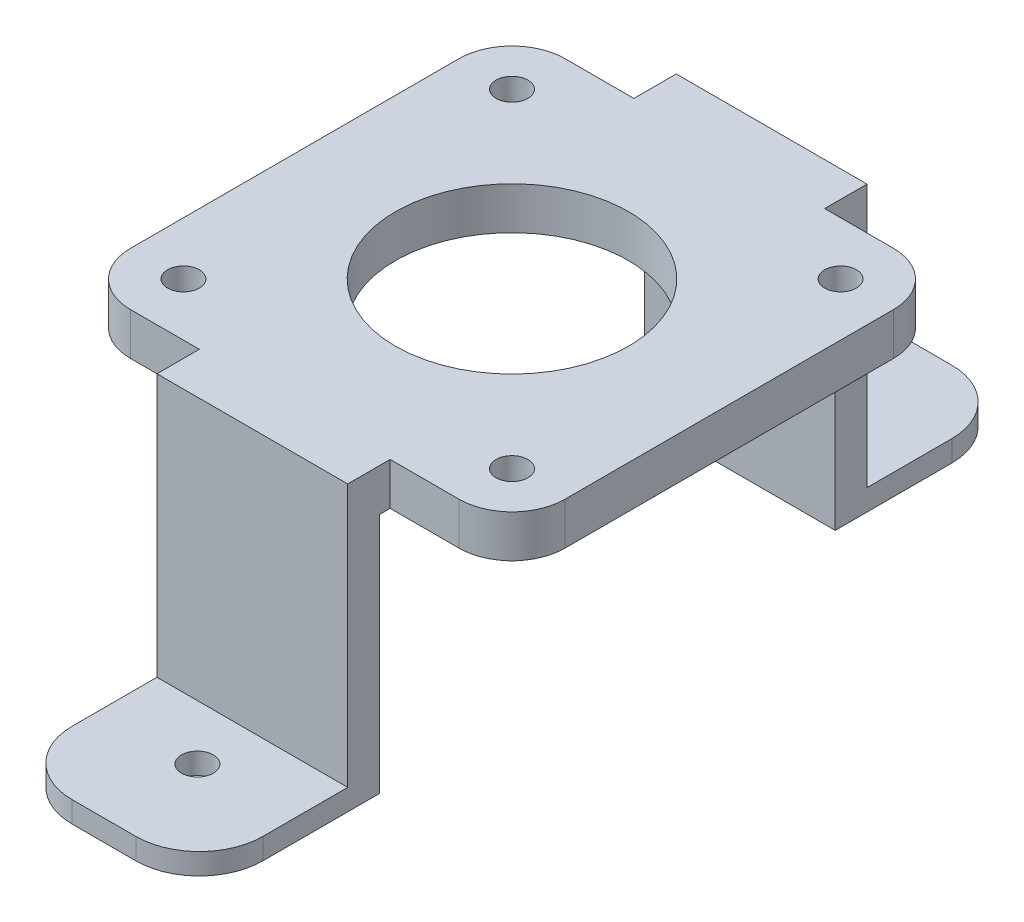
ISO-10303-21;
HEADER;
FILE_DESCRIPTION(('STEP AP214'),'2;1');
FILE_NAME('part.step','',(''),(''),'','','');
FILE_SCHEMA(('AUTOMOTIVE_DESIGN { 1 0 10303 214 1 1 1 1 }'));
ENDSEC;
DATA;
#1=APPLICATION_CONTEXT('core data for automotive mechanical design processes');
#2=APPLICATION_PROTOCOL_DEFINITION('international standard','automotive_design',2000,#1);
#3=PRODUCT_CONTEXT('',#1,'mechanical');
#4=PRODUCT('Part','Part','',(#3));
#5=PRODUCT_RELATED_PRODUCT_CATEGORY('part','',(#4));
#6=PRODUCT_DEFINITION_FORMATION('','',#4);
#7=PRODUCT_DEFINITION_CONTEXT('part definition',#1,'design');
#8=PRODUCT_DEFINITION('design','',#6,#7);
#9=PRODUCT_DEFINITION_SHAPE('','',#8);
#10=(LENGTH_UNIT() NAMED_UNIT(*) SI_UNIT(.MILLI.,.METRE.));
#11=(NAMED_UNIT(*) PLANE_ANGLE_UNIT() SI_UNIT($,.RADIAN.));
#12=(NAMED_UNIT(*) SI_UNIT($,.STERADIAN.) SOLID_ANGLE_UNIT());
#13=UNCERTAINTY_MEASURE_WITH_UNIT(LENGTH_MEASURE(1.E-05),#10,'distance_accuracy_value','');
#14=(GEOMETRIC_REPRESENTATION_CONTEXT(3) GLOBAL_UNCERTAINTY_ASSIGNED_CONTEXT((#13)) GLOBAL_UNIT_ASSIGNED_CONTEXT((#10,
#11,#12)) REPRESENTATION_CONTEXT('',''));
#15=CARTESIAN_POINT('',(0.,0.,0.));
#16=DIRECTION('',(0.,0.,1.));
#17=DIRECTION('',(1.,0.,0.));
#18=AXIS2_PLACEMENT_3D('',#15,#16,#17);
#19=CARTESIAN_POINT('',(-9.00000000000001,4.,-24.5));
#20=DIRECTION('',(-1.,0.,0.));
#21=DIRECTION('',(0.,-1.,0.));
#22=AXIS2_PLACEMENT_3D('',#19,#20,#21);
#23=PLANE('',#22);
#24=DIRECTION('',(0.,1.,0.));
#25=VECTOR('',#24,1.);
#26=CARTESIAN_POINT('',(-9.,-22.8,-21.5));
#27=LINE('',#26,#25);
#28=CARTESIAN_POINT('',(-9.,-22.8,-21.5));
#29=VERTEX_POINT('',#28);
#30=CARTESIAN_POINT('',(-9.,0.,-21.5));
#31=VERTEX_POINT('',#30);
#32=EDGE_CURVE('E61',#29,#31,#27,.T.);
#33=ORIENTED_EDGE('',*,*,#32,.T.);
#34=DIRECTION('',(0.,0.,1.));
#35=VECTOR('',#34,1.);
#36=CARTESIAN_POINT('',(-9.,0.,-21.5));
#37=LINE('',#36,#35);
#38=CARTESIAN_POINT('',(-9.,0.,-20.5));
#39=VERTEX_POINT('',#38);
#40=EDGE_CURVE('E532',#31,#39,#37,.T.);
#41=ORIENTED_EDGE('',*,*,#40,.T.);
#42=DIRECTION('',(0.,-1.,0.));
#43=VECTOR('',#42,1.);
#44=CARTESIAN_POINT('',(-9.00000000000001,4.,-20.5));
#45=LINE('',#44,#43);
#46=CARTESIAN_POINT('',(-9.00000000000001,4.,-20.5));
#47=VERTEX_POINT('',#46);
#48=EDGE_CURVE('E922',#47,#39,#45,.T.);
#49=ORIENTED_EDGE('',*,*,#48,.F.);
#50=DIRECTION('',(0.,0.,1.));
#51=VECTOR('',#50,1.);
#52=CARTESIAN_POINT('',(-9.00000000000001,4.,-24.5));
#53=LINE('',#52,#51);
#54=CARTESIAN_POINT('',(-9.00000000000001,4.,-24.5));
#55=VERTEX_POINT('',#54);
#56=EDGE_CURVE('E261',#55,#47,#53,.T.);
#57=ORIENTED_EDGE('',*,*,#56,.F.);
#58=DIRECTION('',(0.,-1.,0.));
#59=VECTOR('',#58,1.);
#60=CARTESIAN_POINT('',(-9.00000000000001,4.,-24.5));
#61=LINE('',#60,#59);
#62=CARTESIAN_POINT('',(-9.,-20.8,-24.5));
#63=VERTEX_POINT('',#62);
#64=EDGE_CURVE('E934',#55,#63,#61,.T.);
#65=ORIENTED_EDGE('',*,*,#64,.T.);
#66=DIRECTION('',(0.,0.,1.));
#67=VECTOR('',#66,1.);
#68=CARTESIAN_POINT('',(-9.,-20.8,-24.5));
#69=LINE('',#68,#67);
#70=CARTESIAN_POINT('',(-9.,-20.8,-32.5));
#71=VERTEX_POINT('',#70);
#72=EDGE_CURVE('E901',#71,#63,#69,.T.);
#73=ORIENTED_EDGE('',*,*,#72,.F.);
#74=DIRECTION('',(0.,-1.,0.));
#75=VECTOR('',#74,1.);
#76=CARTESIAN_POINT('',(-9.,-20.8,-32.5));
#77=LINE('',#76,#75);
#78=CARTESIAN_POINT('',(-9.,-22.8,-32.5));
#79=VERTEX_POINT('',#78);
#80=EDGE_CURVE('E913',#71,#79,#77,.T.);
#81=ORIENTED_EDGE('',*,*,#80,.T.);
#82=DIRECTION('',(0.,0.,1.));
#83=VECTOR('',#82,1.);
#84=CARTESIAN_POINT('',(-9.,-22.8,-24.5));
#85=LINE('',#84,#83);
#86=EDGE_CURVE('E256',#79,#29,#85,.T.);
#87=ORIENTED_EDGE('',*,*,#86,.T.);
#88=EDGE_LOOP('',(#33,#41,#49,#57,#65,#73,#81,#87));
#89=FACE_BOUND('',#88,.T.);
#90=ADVANCED_FACE('F45',(#89),#23,.T.);
#91=CARTESIAN_POINT('',(8.99999999999999,4.,-24.5));
#92=DIRECTION('',(-1.,0.,0.));
#93=DIRECTION('',(0.,-1.,0.));
#94=AXIS2_PLACEMENT_3D('',#91,#92,#93);
#95=PLANE('',#94);
#96=DIRECTION('',(0.,0.,1.));
#97=VECTOR('',#96,1.);
#98=CARTESIAN_POINT('',(8.99999999999999,0.,-21.5));
#99=LINE('',#98,#97);
#100=CARTESIAN_POINT('',(8.99999999999999,0.,-21.5));
#101=VERTEX_POINT('',#100);
#102=CARTESIAN_POINT('',(8.99999999999999,0.,-20.5));
#103=VERTEX_POINT('',#102);
#104=EDGE_CURVE('E246',#101,#103,#99,.T.);
#105=ORIENTED_EDGE('',*,*,#104,.F.);
#106=DIRECTION('',(0.,-1.,0.));
#107=VECTOR('',#106,1.);
#108=CARTESIAN_POINT('',(8.99999999999999,-22.8,-21.5));
#109=LINE('',#108,#107);
#110=CARTESIAN_POINT('',(8.99999999999999,-22.8,-21.5));
#111=VERTEX_POINT('',#110);
#112=EDGE_CURVE('E233',#101,#111,#109,.T.);
#113=ORIENTED_EDGE('',*,*,#112,.T.);
#114=DIRECTION('',(0.,0.,1.));
#115=VECTOR('',#114,1.);
#116=CARTESIAN_POINT('',(9.,-22.8,-24.5));
#117=LINE('',#116,#115);
#118=CARTESIAN_POINT('',(9.,-22.8,-32.5));
#119=VERTEX_POINT('',#118);
#120=EDGE_CURVE('E243',#119,#111,#117,.T.);
#121=ORIENTED_EDGE('',*,*,#120,.F.);
#122=DIRECTION('',(0.,-1.,0.));
#123=VECTOR('',#122,1.);
#124=CARTESIAN_POINT('',(9.,-20.8,-32.5));
#125=LINE('',#124,#123);
#126=CARTESIAN_POINT('',(9.,-20.8,-32.5));
#127=VERTEX_POINT('',#126);
#128=EDGE_CURVE('E919',#127,#119,#125,.T.);
#129=ORIENTED_EDGE('',*,*,#128,.F.);
#130=DIRECTION('',(0.,0.,-1.));
#131=VECTOR('',#130,1.);
#132=CARTESIAN_POINT('',(9.,-20.8,-24.5));
#133=LINE('',#132,#131);
#134=CARTESIAN_POINT('',(9.,-20.8,-24.5));
#135=VERTEX_POINT('',#134);
#136=EDGE_CURVE('E895',#135,#127,#133,.T.);
#137=ORIENTED_EDGE('',*,*,#136,.F.);
#138=DIRECTION('',(0.,-1.,0.));
#139=VECTOR('',#138,1.);
#140=CARTESIAN_POINT('',(8.99999999999999,4.,-24.5));
#141=LINE('',#140,#139);
#142=CARTESIAN_POINT('',(8.99999999999999,4.,-24.5));
#143=VERTEX_POINT('',#142);
#144=EDGE_CURVE('E263',#143,#135,#141,.T.);
#145=ORIENTED_EDGE('',*,*,#144,.F.);
#146=DIRECTION('',(0.,0.,1.));
#147=VECTOR('',#146,1.);
#148=CARTESIAN_POINT('',(8.99999999999999,4.,-24.5));
#149=LINE('',#148,#147);
#150=CARTESIAN_POINT('',(8.99999999999999,4.,-20.5));
#151=VERTEX_POINT('',#150);
#152=EDGE_CURVE('E255',#143,#151,#149,.T.);
#153=ORIENTED_EDGE('',*,*,#152,.T.);
#154=DIRECTION('',(0.,-1.,0.));
#155=VECTOR('',#154,1.);
#156=CARTESIAN_POINT('',(8.99999999999999,4.,-20.5));
#157=LINE('',#156,#155);
#158=EDGE_CURVE('E938',#151,#103,#157,.T.);
#159=ORIENTED_EDGE('',*,*,#158,.T.);
#160=EDGE_LOOP('',(#105,#113,#121,#129,#137,#145,#153,#159));
#161=FACE_BOUND('',#160,.T.);
#162=ADVANCED_FACE('F241',(#161),#95,.F.);
#163=CARTESIAN_POINT('',(-9.,-22.8,-24.5));
#164=DIRECTION('',(0.,-1.,0.));
#165=DIRECTION('',(0.,0.,-1.));
#166=AXIS2_PLACEMENT_3D('',#163,#164,#165);
#167=PLANE('',#166);
#168=CARTESIAN_POINT('',(0.,-22.8,-29.6787295351869));
#169=DIRECTION('',(0.,-1.,0.));
#170=DIRECTION('',(0.,0.,-1.));
#171=AXIS2_PLACEMENT_3D('',#168,#169,#170);
#172=CIRCLE('',#171,1.5);
#173=CARTESIAN_POINT('',(0.,-22.8,-31.1787295351869));
#174=VERTEX_POINT('',#173);
#175=EDGE_CURVE('E880',#174,#174,#172,.T.);
#176=ORIENTED_EDGE('',*,*,#175,.F.);
#177=EDGE_LOOP('',(#176));
#178=FACE_BOUND('',#177,.T.);
#179=ORIENTED_EDGE('',*,*,#120,.T.);
#180=DIRECTION('',(-1.,0.,0.));
#181=VECTOR('',#180,1.);
#182=CARTESIAN_POINT('',(-9.,-22.8,-21.5));
#183=LINE('',#182,#181);
#184=EDGE_CURVE('E230',#111,#29,#183,.T.);
#185=ORIENTED_EDGE('',*,*,#184,.T.);
#186=ORIENTED_EDGE('',*,*,#86,.F.);
#187=CARTESIAN_POINT('',(-3.,-22.8,-32.5));
#188=DIRECTION('',(0.,1.,0.));
#189=DIRECTION('',(0.,0.,1.));
#190=AXIS2_PLACEMENT_3D('',#187,#188,#189);
#191=CIRCLE('',#190,6.);
#192=CARTESIAN_POINT('',(-3.,-22.8,-38.5));
#193=VERTEX_POINT('',#192);
#194=EDGE_CURVE('E882',#193,#79,#191,.T.);
#195=ORIENTED_EDGE('',*,*,#194,.F.);
#196=DIRECTION('',(-1.,0.,0.));
#197=VECTOR('',#196,1.);
#198=CARTESIAN_POINT('',(3.,-22.8,-38.5));
#199=LINE('',#198,#197);
#200=CARTESIAN_POINT('',(3.,-22.8,-38.5));
#201=VERTEX_POINT('',#200);
#202=EDGE_CURVE('E888',#201,#193,#199,.T.);
#203=ORIENTED_EDGE('',*,*,#202,.F.);
#204=CARTESIAN_POINT('',(3.,-22.8,-32.5));
#205=DIRECTION('',(0.,1.,0.));
#206=DIRECTION('',(0.,0.,-1.));
#207=AXIS2_PLACEMENT_3D('',#204,#205,#206);
#208=CIRCLE('',#207,6.);
#209=EDGE_CURVE('E252',#119,#201,#208,.T.);
#210=ORIENTED_EDGE('',*,*,#209,.F.);
#211=EDGE_LOOP('',(#179,#185,#186,#195,#203,#210));
#212=FACE_BOUND('',#211,.T.);
#213=ADVANCED_FACE('F250',(#178,#212),#167,.T.);
#214=CARTESIAN_POINT('',(-15.5,4.,-20.5));
#215=DIRECTION('',(0.,0.,1.));
#216=DIRECTION('',(1.,0.,0.));
#217=AXIS2_PLACEMENT_3D('',#214,#215,#216);
#218=PLANE('',#217);
#219=ORIENTED_EDGE('',*,*,#158,.F.);
#220=DIRECTION('',(-1.,0.,0.));
#221=VECTOR('',#220,1.);
#222=CARTESIAN_POINT('',(-15.5,4.,-20.5));
#223=LINE('',#222,#221);
#224=CARTESIAN_POINT('',(15.5,4.,-20.5));
#225=VERTEX_POINT('',#224);
#226=EDGE_CURVE('E448',#225,#151,#223,.T.);
#227=ORIENTED_EDGE('',*,*,#226,.F.);
#228=DIRECTION('',(0.,-1.,0.));
#229=VECTOR('',#228,1.);
#230=CARTESIAN_POINT('',(15.5,4.,-20.5));
#231=LINE('',#230,#229);
#232=CARTESIAN_POINT('',(15.5,0.,-20.5));
#233=VERTEX_POINT('',#232);
#234=EDGE_CURVE('E483',#225,#233,#231,.T.);
#235=ORIENTED_EDGE('',*,*,#234,.T.);
#236=DIRECTION('',(-1.,0.,0.));
#237=VECTOR('',#236,1.);
#238=CARTESIAN_POINT('',(-15.5,0.,-20.5));
#239=LINE('',#238,#237);
#240=EDGE_CURVE('E427',#233,#103,#239,.T.);
#241=ORIENTED_EDGE('',*,*,#240,.T.);
#242=EDGE_LOOP('',(#219,#227,#235,#241));
#243=FACE_BOUND('',#242,.T.);
#244=ADVANCED_FACE('F569',(#243),#218,.F.);
#245=CARTESIAN_POINT('',(-9.,-22.8,24.5));
#246=DIRECTION('',(0.,1.,0.));
#247=DIRECTION('',(0.,0.,1.));
#248=AXIS2_PLACEMENT_3D('',#245,#246,#247);
#249=PLANE('',#248);
#250=CARTESIAN_POINT('',(0.,-22.8,29.6787295351869));
#251=DIRECTION('',(0.,1.,0.));
#252=DIRECTION('',(0.,0.,1.));
#253=AXIS2_PLACEMENT_3D('',#250,#251,#252);
#254=CIRCLE('',#253,1.5);
#255=CARTESIAN_POINT('',(0.,-22.8,31.1787295351869));
#256=VERTEX_POINT('',#255);
#257=EDGE_CURVE('E290',#256,#256,#254,.T.);
#258=ORIENTED_EDGE('',*,*,#257,.T.);
#259=EDGE_LOOP('',(#258));
#260=FACE_BOUND('',#259,.T.);
#261=DIRECTION('',(-1.,0.,0.));
#262=VECTOR('',#261,1.);
#263=CARTESIAN_POINT('',(-9.,-22.8,21.5));
#264=LINE('',#263,#262);
#265=CARTESIAN_POINT('',(8.99999999999999,-22.8,21.5));
#266=VERTEX_POINT('',#265);
#267=CARTESIAN_POINT('',(-9.,-22.8,21.5));
#268=VERTEX_POINT('',#267);
#269=EDGE_CURVE('E280',#266,#268,#264,.T.);
#270=ORIENTED_EDGE('',*,*,#269,.F.);
#271=DIRECTION('',(0.,0.,-1.));
#272=VECTOR('',#271,1.);
#273=CARTESIAN_POINT('',(9.,-22.8,24.5));
#274=LINE('',#273,#272);
#275=CARTESIAN_POINT('',(9.,-22.8,32.5));
#276=VERTEX_POINT('',#275);
#277=EDGE_CURVE('E373',#276,#266,#274,.T.);
#278=ORIENTED_EDGE('',*,*,#277,.F.);
#279=CARTESIAN_POINT('',(3.,-22.8,32.5));
#280=DIRECTION('',(0.,-1.,0.));
#281=DIRECTION('',(0.,0.,1.));
#282=AXIS2_PLACEMENT_3D('',#279,#280,#281);
#283=CIRCLE('',#282,6.);
#284=CARTESIAN_POINT('',(3.,-22.8,38.5));
#285=VERTEX_POINT('',#284);
#286=EDGE_CURVE('E294',#276,#285,#283,.T.);
#287=ORIENTED_EDGE('',*,*,#286,.T.);
#288=DIRECTION('',(-1.,0.,0.));
#289=VECTOR('',#288,1.);
#290=CARTESIAN_POINT('',(3.,-22.8,38.5));
#291=LINE('',#290,#289);
#292=CARTESIAN_POINT('',(-3.,-22.8,38.5));
#293=VERTEX_POINT('',#292);
#294=EDGE_CURVE('E326',#285,#293,#291,.T.);
#295=ORIENTED_EDGE('',*,*,#294,.T.);
#296=CARTESIAN_POINT('',(-3.,-22.8,32.5));
#297=DIRECTION('',(0.,-1.,0.));
#298=DIRECTION('',(0.,0.,-1.));
#299=AXIS2_PLACEMENT_3D('',#296,#297,#298);
#300=CIRCLE('',#299,6.);
#301=CARTESIAN_POINT('',(-9.,-22.8,32.5));
#302=VERTEX_POINT('',#301);
#303=EDGE_CURVE('E303',#293,#302,#300,.T.);
#304=ORIENTED_EDGE('',*,*,#303,.T.);
#305=DIRECTION('',(0.,0.,-1.));
#306=VECTOR('',#305,1.);
#307=CARTESIAN_POINT('',(-9.,-22.8,24.5));
#308=LINE('',#307,#306);
#309=EDGE_CURVE('E377',#302,#268,#308,.T.);
#310=ORIENTED_EDGE('',*,*,#309,.T.);
#311=EDGE_LOOP('',(#270,#278,#287,#295,#304,#310));
#312=FACE_BOUND('',#311,.T.);
#313=ADVANCED_FACE('F582',(#260,#312),#249,.F.);
#314=CARTESIAN_POINT('',(0.,0.,24.5));
#315=DIRECTION('',(0.,0.,1.));
#316=DIRECTION('',(1.,0.,0.));
#317=AXIS2_PLACEMENT_3D('',#314,#315,#316);
#318=PLANE('',#317);
#319=DIRECTION('',(0.,-1.,0.));
#320=VECTOR('',#319,1.);
#321=CARTESIAN_POINT('',(-9.00000000000001,4.,24.5));
#322=LINE('',#321,#320);
#323=CARTESIAN_POINT('',(-9.00000000000001,4.,24.5));
#324=VERTEX_POINT('',#323);
#325=CARTESIAN_POINT('',(-9.,-20.8,24.5));
#326=VERTEX_POINT('',#325);
#327=EDGE_CURVE('E347',#324,#326,#322,.T.);
#328=ORIENTED_EDGE('',*,*,#327,.T.);
#329=DIRECTION('',(1.,0.,0.));
#330=VECTOR('',#329,1.);
#331=CARTESIAN_POINT('',(9.,-20.8,24.5));
#332=LINE('',#331,#330);
#333=CARTESIAN_POINT('',(9.,-20.8,24.5));
#334=VERTEX_POINT('',#333);
#335=EDGE_CURVE('E318',#326,#334,#332,.T.);
#336=ORIENTED_EDGE('',*,*,#335,.T.);
#337=DIRECTION('',(0.,-1.,0.));
#338=VECTOR('',#337,1.);
#339=CARTESIAN_POINT('',(8.99999999999999,4.,24.5));
#340=LINE('',#339,#338);
#341=CARTESIAN_POINT('',(8.99999999999999,4.,24.5));
#342=VERTEX_POINT('',#341);
#343=EDGE_CURVE('E351',#342,#334,#340,.T.);
#344=ORIENTED_EDGE('',*,*,#343,.F.);
#345=DIRECTION('',(1.,0.,0.));
#346=VECTOR('',#345,1.);
#347=CARTESIAN_POINT('',(-9.00000000000001,4.,24.5));
#348=LINE('',#347,#346);
#349=EDGE_CURVE('E356',#324,#342,#348,.T.);
#350=ORIENTED_EDGE('',*,*,#349,.F.);
#351=EDGE_LOOP('',(#328,#336,#344,#350));
#352=FACE_BOUND('',#351,.T.);
#353=ADVANCED_FACE('F619',(#352),#318,.T.);
#354=CARTESIAN_POINT('',(-15.5,4.,20.5));
#355=DIRECTION('',(0.,0.,-1.));
#356=DIRECTION('',(-1.,0.,0.));
#357=AXIS2_PLACEMENT_3D('',#354,#355,#356);
#358=PLANE('',#357);
#359=DIRECTION('',(0.,-1.,0.));
#360=VECTOR('',#359,1.);
#361=CARTESIAN_POINT('',(-9.00000000000001,4.,20.5));
#362=LINE('',#361,#360);
#363=CARTESIAN_POINT('',(-9.00000000000001,4.,20.5));
#364=VERTEX_POINT('',#363);
#365=CARTESIAN_POINT('',(-9.,0.,20.5));
#366=VERTEX_POINT('',#365);
#367=EDGE_CURVE('E337',#364,#366,#362,.T.);
#368=ORIENTED_EDGE('',*,*,#367,.F.);
#369=DIRECTION('',(1.,0.,0.));
#370=VECTOR('',#369,1.);
#371=CARTESIAN_POINT('',(-15.5,4.,20.5));
#372=LINE('',#371,#370);
#373=CARTESIAN_POINT('',(-15.5,4.,20.5));
#374=VERTEX_POINT('',#373);
#375=EDGE_CURVE('E434',#374,#364,#372,.T.);
#376=ORIENTED_EDGE('',*,*,#375,.F.);
#377=DIRECTION('',(0.,-1.,0.));
#378=VECTOR('',#377,1.);
#379=CARTESIAN_POINT('',(-15.5,4.,20.5));
#380=LINE('',#379,#378);
#381=CARTESIAN_POINT('',(-15.5,0.,20.5));
#382=VERTEX_POINT('',#381);
#383=EDGE_CURVE('E499',#374,#382,#380,.T.);
#384=ORIENTED_EDGE('',*,*,#383,.T.);
#385=DIRECTION('',(1.,0.,0.));
#386=VECTOR('',#385,1.);
#387=CARTESIAN_POINT('',(-15.5,0.,20.5));
#388=LINE('',#387,#386);
#389=EDGE_CURVE('E463',#382,#366,#388,.T.);
#390=ORIENTED_EDGE('',*,*,#389,.T.);
#391=EDGE_LOOP('',(#368,#376,#384,#390));
#392=FACE_BOUND('',#391,.T.);
#393=ADVANCED_FACE('F519',(#392),#358,.F.);
#394=CARTESIAN_POINT('',(-15.5,4.,-15.5));
#395=DIRECTION('',(0.,1.,0.));
#396=DIRECTION('',(0.,0.,1.));
#397=AXIS2_PLACEMENT_3D('',#394,#395,#396);
#398=PLANE('',#397);
#399=CARTESIAN_POINT('',(-15.5,4.,15.5));
#400=DIRECTION('',(0.,1.,0.));
#401=DIRECTION('',(0.,0.,-1.));
#402=AXIS2_PLACEMENT_3D('',#399,#400,#401);
#403=CIRCLE('',#402,1.5);
#404=CARTESIAN_POINT('',(-15.5,4.,14.));
#405=VERTEX_POINT('',#404);
#406=EDGE_CURVE('E390',#405,#405,#403,.T.);
#407=ORIENTED_EDGE('',*,*,#406,.F.);
#408=EDGE_LOOP('',(#407));
#409=FACE_BOUND('',#408,.T.);
#410=CARTESIAN_POINT('',(-15.5,4.,-15.5));
#411=DIRECTION('',(0.,1.,0.));
#412=DIRECTION('',(0.,0.,1.));
#413=AXIS2_PLACEMENT_3D('',#410,#411,#412);
#414=CIRCLE('',#413,1.5);
#415=CARTESIAN_POINT('',(-15.5,4.,-14.));
#416=VERTEX_POINT('',#415);
#417=EDGE_CURVE('E406',#416,#416,#414,.T.);
#418=ORIENTED_EDGE('',*,*,#417,.F.);
#419=EDGE_LOOP('',(#418));
#420=FACE_BOUND('',#419,.T.);
#421=CARTESIAN_POINT('',(-15.5,4.,-15.5));
#422=DIRECTION('',(0.,1.,0.));
#423=DIRECTION('',(0.,0.,1.));
#424=AXIS2_PLACEMENT_3D('',#421,#422,#423);
#425=CIRCLE('',#424,5.);
#426=CARTESIAN_POINT('',(-15.5,4.,-20.5));
#427=VERTEX_POINT('',#426);
#428=CARTESIAN_POINT('',(-20.5,4.,-15.5));
#429=VERTEX_POINT('',#428);
#430=EDGE_CURVE('E422',#427,#429,#425,.T.);
#431=ORIENTED_EDGE('',*,*,#430,.T.);
#432=DIRECTION('',(0.,0.,1.));
#433=VECTOR('',#432,1.);
#434=CARTESIAN_POINT('',(-20.5,4.,15.5));
#435=LINE('',#434,#433);
#436=CARTESIAN_POINT('',(-20.5,4.,15.5));
#437=VERTEX_POINT('',#436);
#438=EDGE_CURVE('E426',#429,#437,#435,.T.);
#439=ORIENTED_EDGE('',*,*,#438,.T.);
#440=CARTESIAN_POINT('',(-15.5,4.,15.5));
#441=DIRECTION('',(0.,1.,0.));
#442=DIRECTION('',(0.,0.,-1.));
#443=AXIS2_PLACEMENT_3D('',#440,#441,#442);
#444=CIRCLE('',#443,5.);
#445=EDGE_CURVE('E430',#437,#374,#444,.T.);
#446=ORIENTED_EDGE('',*,*,#445,.T.);
#447=ORIENTED_EDGE('',*,*,#375,.T.);
#448=DIRECTION('',(0.,0.,-1.));
#449=VECTOR('',#448,1.);
#450=CARTESIAN_POINT('',(-9.00000000000001,4.,24.5));
#451=LINE('',#450,#449);
#452=EDGE_CURVE('E360',#324,#364,#451,.T.);
#453=ORIENTED_EDGE('',*,*,#452,.F.);
#454=ORIENTED_EDGE('',*,*,#349,.T.);
#455=DIRECTION('',(0.,0.,-1.));
#456=VECTOR('',#455,1.);
#457=CARTESIAN_POINT('',(8.99999999999999,4.,24.5));
#458=LINE('',#457,#456);
#459=CARTESIAN_POINT('',(8.99999999999999,4.,20.5));
#460=VERTEX_POINT('',#459);
#461=EDGE_CURVE('E369',#342,#460,#458,.T.);
#462=ORIENTED_EDGE('',*,*,#461,.T.);
#463=CARTESIAN_POINT('',(15.5,4.,20.5));
#464=VERTEX_POINT('',#463);
#465=EDGE_CURVE('E433',#460,#464,#372,.T.);
#466=ORIENTED_EDGE('',*,*,#465,.T.);
#467=CARTESIAN_POINT('',(15.5,4.,15.5));
#468=DIRECTION('',(0.,1.,0.));
#469=DIRECTION('',(0.,0.,1.));
#470=AXIS2_PLACEMENT_3D('',#467,#468,#469);
#471=CIRCLE('',#470,5.);
#472=CARTESIAN_POINT('',(20.5,4.,15.5));
#473=VERTEX_POINT('',#472);
#474=EDGE_CURVE('E438',#464,#473,#471,.T.);
#475=ORIENTED_EDGE('',*,*,#474,.T.);
#476=DIRECTION('',(0.,0.,-1.));
#477=VECTOR('',#476,1.);
#478=CARTESIAN_POINT('',(20.5,4.,15.5));
#479=LINE('',#478,#477);
#480=CARTESIAN_POINT('',(20.5,4.,-15.5));
#481=VERTEX_POINT('',#480);
#482=EDGE_CURVE('E441',#473,#481,#479,.T.);
#483=ORIENTED_EDGE('',*,*,#482,.T.);
#484=CARTESIAN_POINT('',(15.5,4.,-15.5));
#485=DIRECTION('',(0.,1.,0.));
#486=DIRECTION('',(0.,0.,1.));
#487=AXIS2_PLACEMENT_3D('',#484,#485,#486);
#488=CIRCLE('',#487,5.);
#489=EDGE_CURVE('E444',#481,#225,#488,.T.);
#490=ORIENTED_EDGE('',*,*,#489,.T.);
#491=ORIENTED_EDGE('',*,*,#226,.T.);
#492=ORIENTED_EDGE('',*,*,#152,.F.);
#493=DIRECTION('',(1.,0.,0.));
#494=VECTOR('',#493,1.);
#495=CARTESIAN_POINT('',(-9.00000000000001,4.,-24.5));
#496=LINE('',#495,#494);
#497=EDGE_CURVE('E937',#55,#143,#496,.T.);
#498=ORIENTED_EDGE('',*,*,#497,.F.);
#499=ORIENTED_EDGE('',*,*,#56,.T.);
#500=EDGE_CURVE('E447',#47,#427,#223,.T.);
#501=ORIENTED_EDGE('',*,*,#500,.T.);
#502=EDGE_LOOP('',(#431,#439,#446,#447,#453,#454,#462,#466,#475,#483,#490,#491,#492,#498,#499,#501));
#503=FACE_BOUND('',#502,.T.);
#504=CARTESIAN_POINT('',(0.,4.,0.));
#505=DIRECTION('',(0.,1.,0.));
#506=DIRECTION('',(0.,0.,1.));
#507=AXIS2_PLACEMENT_3D('',#504,#505,#506);
#508=CIRCLE('',#507,11.);
#509=CARTESIAN_POINT('',(0.,4.,11.));
#510=VERTEX_POINT('',#509);
#511=EDGE_CURVE('E414',#510,#510,#508,.T.);
#512=ORIENTED_EDGE('',*,*,#511,.F.);
#513=EDGE_LOOP('',(#512));
#514=FACE_BOUND('',#513,.T.);
#515=CARTESIAN_POINT('',(15.5,4.,15.5));
#516=DIRECTION('',(0.,1.,0.));
#517=DIRECTION('',(0.,0.,-1.));
#518=AXIS2_PLACEMENT_3D('',#515,#516,#517);
#519=CIRCLE('',#518,1.5);
#520=CARTESIAN_POINT('',(15.5,4.,14.));
#521=VERTEX_POINT('',#520);
#522=EDGE_CURVE('E398',#521,#521,#519,.T.);
#523=ORIENTED_EDGE('',*,*,#522,.F.);
#524=EDGE_LOOP('',(#523));
#525=FACE_BOUND('',#524,.T.);
#526=CARTESIAN_POINT('',(15.5,4.,-15.5));
#527=DIRECTION('',(0.,1.,0.));
#528=DIRECTION('',(0.,0.,1.));
#529=AXIS2_PLACEMENT_3D('',#526,#527,#528);
#530=CIRCLE('',#529,1.49999999999999);
#531=CARTESIAN_POINT('',(15.5,4.,-14.));
#532=VERTEX_POINT('',#531);
#533=EDGE_CURVE('E382',#532,#532,#530,.T.);
#534=ORIENTED_EDGE('',*,*,#533,.F.);
#535=EDGE_LOOP('',(#534));
#536=FACE_BOUND('',#535,.T.);
#537=ADVANCED_FACE('F522',(#409,#420,#503,#514,#525,#536),#398,.T.);
#538=CARTESIAN_POINT('',(-15.5,0.,-15.5));
#539=DIRECTION('',(0.,1.,0.));
#540=DIRECTION('',(0.,0.,1.));
#541=AXIS2_PLACEMENT_3D('',#538,#539,#540);
#542=PLANE('',#541);
#543=CARTESIAN_POINT('',(-15.5,0.,-15.5));
#544=DIRECTION('',(0.,1.,0.));
#545=DIRECTION('',(0.,0.,1.));
#546=AXIS2_PLACEMENT_3D('',#543,#544,#545);
#547=CIRCLE('',#546,5.);
#548=CARTESIAN_POINT('',(-15.5,0.,-20.5));
#549=VERTEX_POINT('',#548);
#550=CARTESIAN_POINT('',(-20.5,0.,-15.5));
#551=VERTEX_POINT('',#550);
#552=EDGE_CURVE('E418',#549,#551,#547,.T.);
#553=ORIENTED_EDGE('',*,*,#552,.F.);
#554=EDGE_CURVE('E476',#39,#549,#239,.T.);
#555=ORIENTED_EDGE('',*,*,#554,.F.);
#556=ORIENTED_EDGE('',*,*,#40,.F.);
#557=DIRECTION('',(1.,0.,0.));
#558=VECTOR('',#557,1.);
#559=CARTESIAN_POINT('',(-9.,0.,-21.5));
#560=LINE('',#559,#558);
#561=EDGE_CURVE('E248',#31,#101,#560,.T.);
#562=ORIENTED_EDGE('',*,*,#561,.T.);
#563=ORIENTED_EDGE('',*,*,#104,.T.);
#564=ORIENTED_EDGE('',*,*,#240,.F.);
#565=CARTESIAN_POINT('',(15.5,0.,-15.5));
#566=DIRECTION('',(0.,1.,0.));
#567=DIRECTION('',(0.,0.,1.));
#568=AXIS2_PLACEMENT_3D('',#565,#566,#567);
#569=CIRCLE('',#568,5.);
#570=CARTESIAN_POINT('',(20.5,0.,-15.5));
#571=VERTEX_POINT('',#570);
#572=EDGE_CURVE('E473',#571,#233,#569,.T.);
#573=ORIENTED_EDGE('',*,*,#572,.F.);
#574=DIRECTION('',(0.,0.,-1.));
#575=VECTOR('',#574,1.);
#576=CARTESIAN_POINT('',(20.5,0.,15.5));
#577=LINE('',#576,#575);
#578=CARTESIAN_POINT('',(20.5,0.,15.5));
#579=VERTEX_POINT('',#578);
#580=EDGE_CURVE('E470',#579,#571,#577,.T.);
#581=ORIENTED_EDGE('',*,*,#580,.F.);
#582=CARTESIAN_POINT('',(15.5,0.,15.5));
#583=DIRECTION('',(0.,1.,0.));
#584=DIRECTION('',(0.,0.,1.));
#585=AXIS2_PLACEMENT_3D('',#582,#583,#584);
#586=CIRCLE('',#585,5.);
#587=CARTESIAN_POINT('',(15.5,0.,20.5));
#588=VERTEX_POINT('',#587);
#589=EDGE_CURVE('E467',#588,#579,#586,.T.);
#590=ORIENTED_EDGE('',*,*,#589,.F.);
#591=CARTESIAN_POINT('',(8.99999999999999,0.,20.5));
#592=VERTEX_POINT('',#591);
#593=EDGE_CURVE('E462',#592,#588,#388,.T.);
#594=ORIENTED_EDGE('',*,*,#593,.F.);
#595=DIRECTION('',(0.,0.,-1.));
#596=VECTOR('',#595,1.);
#597=CARTESIAN_POINT('',(8.99999999999999,0.,21.5));
#598=LINE('',#597,#596);
#599=CARTESIAN_POINT('',(8.99999999999999,0.,21.5));
#600=VERTEX_POINT('',#599);
#601=EDGE_CURVE('E284',#600,#592,#598,.T.);
#602=ORIENTED_EDGE('',*,*,#601,.F.);
#603=DIRECTION('',(1.,0.,0.));
#604=VECTOR('',#603,1.);
#605=CARTESIAN_POINT('',(-9.,0.,21.5));
#606=LINE('',#605,#604);
#607=CARTESIAN_POINT('',(-9.,0.,21.5));
#608=VERTEX_POINT('',#607);
#609=EDGE_CURVE('E274',#608,#600,#606,.T.);
#610=ORIENTED_EDGE('',*,*,#609,.F.);
#611=DIRECTION('',(0.,0.,-1.));
#612=VECTOR('',#611,1.);
#613=CARTESIAN_POINT('',(-9.,0.,21.5));
#614=LINE('',#613,#612);
#615=EDGE_CURVE('E283',#608,#366,#614,.T.);
#616=ORIENTED_EDGE('',*,*,#615,.T.);
#617=ORIENTED_EDGE('',*,*,#389,.F.);
#618=CARTESIAN_POINT('',(-15.5,0.,15.5));
#619=DIRECTION('',(0.,1.,0.));
#620=DIRECTION('',(0.,0.,-1.));
#621=AXIS2_PLACEMENT_3D('',#618,#619,#620);
#622=CIRCLE('',#621,5.);
#623=CARTESIAN_POINT('',(-20.5,0.,15.5));
#624=VERTEX_POINT('',#623);
#625=EDGE_CURVE('E459',#624,#382,#622,.T.);
#626=ORIENTED_EDGE('',*,*,#625,.F.);
#627=DIRECTION('',(0.,0.,1.));
#628=VECTOR('',#627,1.);
#629=CARTESIAN_POINT('',(-20.5,0.,15.5));
#630=LINE('',#629,#628);
#631=EDGE_CURVE('E456',#551,#624,#630,.T.);
#632=ORIENTED_EDGE('',*,*,#631,.F.);
#633=EDGE_LOOP('',(#553,#555,#556,#562,#563,#564,#573,#581,#590,#594,#602,#610,#616,#617,#626,#632));
#634=FACE_BOUND('',#633,.T.);
#635=CARTESIAN_POINT('',(0.,0.,0.));
#636=DIRECTION('',(0.,1.,0.));
#637=DIRECTION('',(0.,0.,1.));
#638=AXIS2_PLACEMENT_3D('',#635,#636,#637);
#639=CIRCLE('',#638,11.);
#640=CARTESIAN_POINT('',(0.,0.,11.));
#641=VERTEX_POINT('',#640);
#642=EDGE_CURVE('E410',#641,#641,#639,.T.);
#643=ORIENTED_EDGE('',*,*,#642,.T.);
#644=EDGE_LOOP('',(#643));
#645=FACE_BOUND('',#644,.T.);
#646=CARTESIAN_POINT('',(-15.5,0.,-15.5));
#647=DIRECTION('',(0.,1.,0.));
#648=DIRECTION('',(0.,0.,1.));
#649=AXIS2_PLACEMENT_3D('',#646,#647,#648);
#650=CIRCLE('',#649,1.5);
#651=CARTESIAN_POINT('',(-15.5,0.,-14.));
#652=VERTEX_POINT('',#651);
#653=EDGE_CURVE('E402',#652,#652,#650,.T.);
#654=ORIENTED_EDGE('',*,*,#653,.T.);
#655=EDGE_LOOP('',(#654));
#656=FACE_BOUND('',#655,.T.);
#657=CARTESIAN_POINT('',(15.5,0.,15.5));
#658=DIRECTION('',(0.,1.,0.));
#659=DIRECTION('',(0.,0.,-1.));
#660=AXIS2_PLACEMENT_3D('',#657,#658,#659);
#661=CIRCLE('',#660,1.5);
#662=CARTESIAN_POINT('',(15.5,0.,14.));
#663=VERTEX_POINT('',#662);
#664=EDGE_CURVE('E394',#663,#663,#661,.T.);
#665=ORIENTED_EDGE('',*,*,#664,.T.);
#666=EDGE_LOOP('',(#665));
#667=FACE_BOUND('',#666,.T.);
#668=CARTESIAN_POINT('',(-15.5,0.,15.5));
#669=DIRECTION('',(0.,1.,0.));
#670=DIRECTION('',(0.,0.,-1.));
#671=AXIS2_PLACEMENT_3D('',#668,#669,#670);
#672=CIRCLE('',#671,1.5);
#673=CARTESIAN_POINT('',(-15.5,0.,14.));
#674=VERTEX_POINT('',#673);
#675=EDGE_CURVE('E386',#674,#674,#672,.T.);
#676=ORIENTED_EDGE('',*,*,#675,.T.);
#677=EDGE_LOOP('',(#676));
#678=FACE_BOUND('',#677,.T.);
#679=CARTESIAN_POINT('',(15.5,0.,-15.5));
#680=DIRECTION('',(0.,1.,0.));
#681=DIRECTION('',(0.,0.,1.));
#682=AXIS2_PLACEMENT_3D('',#679,#680,#681);
#683=CIRCLE('',#682,1.49999999999999);
#684=CARTESIAN_POINT('',(15.5,0.,-14.));
#685=VERTEX_POINT('',#684);
#686=EDGE_CURVE('E381',#685,#685,#683,.T.);
#687=ORIENTED_EDGE('',*,*,#686,.T.);
#688=EDGE_LOOP('',(#687));
#689=FACE_BOUND('',#688,.T.);
#690=ADVANCED_FACE('F514',(#634,#645,#656,#667,#678,#689),#542,.F.);
#691=CARTESIAN_POINT('',(-15.5,4.,-15.5));
#692=DIRECTION('',(0.,-1.,0.));
#693=DIRECTION('',(0.,0.,-1.));
#694=AXIS2_PLACEMENT_3D('',#691,#692,#693);
#695=CYLINDRICAL_SURFACE('',#694,5.);
#696=ORIENTED_EDGE('',*,*,#552,.T.);
#697=DIRECTION('',(0.,-1.,0.));
#698=VECTOR('',#697,1.);
#699=CARTESIAN_POINT('',(-20.5,4.,-15.5));
#700=LINE('',#699,#698);
#701=EDGE_CURVE('E11',#429,#551,#700,.T.);
#702=ORIENTED_EDGE('',*,*,#701,.F.);
#703=ORIENTED_EDGE('',*,*,#430,.F.);
#704=DIRECTION('',(0.,-1.,0.));
#705=VECTOR('',#704,1.);
#706=CARTESIAN_POINT('',(-15.5,4.,-20.5));
#707=LINE('',#706,#705);
#708=EDGE_CURVE('E452',#427,#549,#707,.T.);
#709=ORIENTED_EDGE('',*,*,#708,.T.);
#710=EDGE_LOOP('',(#696,#702,#703,#709));
#711=FACE_BOUND('',#710,.T.);
#712=ADVANCED_FACE('F47',(#711),#695,.T.);
#713=CARTESIAN_POINT('',(-20.5,4.,15.5));
#714=DIRECTION('',(1.,0.,0.));
#715=DIRECTION('',(0.,0.,-1.));
#716=AXIS2_PLACEMENT_3D('',#713,#714,#715);
#717=PLANE('',#716);
#718=ORIENTED_EDGE('',*,*,#631,.T.);
#719=DIRECTION('',(0.,-1.,0.));
#720=VECTOR('',#719,1.);
#721=CARTESIAN_POINT('',(-20.5,4.,15.5));
#722=LINE('',#721,#720);
#723=EDGE_CURVE('E54',#437,#624,#722,.T.);
#724=ORIENTED_EDGE('',*,*,#723,.F.);
#725=ORIENTED_EDGE('',*,*,#438,.F.);
#726=ORIENTED_EDGE('',*,*,#701,.T.);
#727=EDGE_LOOP('',(#718,#724,#725,#726));
#728=FACE_BOUND('',#727,.T.);
#729=ADVANCED_FACE('F527',(#728),#717,.F.);
#730=CARTESIAN_POINT('',(-15.5,4.,15.5));
#731=DIRECTION('',(0.,-1.,0.));
#732=DIRECTION('',(0.,0.,-1.));
#733=AXIS2_PLACEMENT_3D('',#730,#731,#732);
#734=CYLINDRICAL_SURFACE('',#733,5.);
#735=ORIENTED_EDGE('',*,*,#625,.T.);
#736=ORIENTED_EDGE('',*,*,#383,.F.);
#737=ORIENTED_EDGE('',*,*,#445,.F.);
#738=ORIENTED_EDGE('',*,*,#723,.T.);
#739=EDGE_LOOP('',(#735,#736,#737,#738));
#740=FACE_BOUND('',#739,.T.);
#741=ADVANCED_FACE('F508',(#740),#734,.T.);
#742=ORIENTED_EDGE('',*,*,#465,.F.);
#743=DIRECTION('',(0.,-1.,0.));
#744=VECTOR('',#743,1.);
#745=CARTESIAN_POINT('',(8.99999999999999,4.,20.5));
#746=LINE('',#745,#744);
#747=EDGE_CURVE('E352',#460,#592,#746,.T.);
#748=ORIENTED_EDGE('',*,*,#747,.T.);
#749=ORIENTED_EDGE('',*,*,#593,.T.);
#750=DIRECTION('',(0.,-1.,0.));
#751=VECTOR('',#750,1.);
#752=CARTESIAN_POINT('',(15.5,4.,20.5));
#753=LINE('',#752,#751);
#754=EDGE_CURVE('E495',#464,#588,#753,.T.);
#755=ORIENTED_EDGE('',*,*,#754,.F.);
#756=EDGE_LOOP('',(#742,#748,#749,#755));
#757=FACE_BOUND('',#756,.T.);
#758=ADVANCED_FACE('F541',(#757),#358,.F.);
#759=CARTESIAN_POINT('',(15.5,4.,15.5));
#760=DIRECTION('',(0.,-1.,0.));
#761=DIRECTION('',(0.,0.,-1.));
#762=AXIS2_PLACEMENT_3D('',#759,#760,#761);
#763=CYLINDRICAL_SURFACE('',#762,5.);
#764=ORIENTED_EDGE('',*,*,#589,.T.);
#765=DIRECTION('',(0.,-1.,0.));
#766=VECTOR('',#765,1.);
#767=CARTESIAN_POINT('',(20.5,4.,15.5));
#768=LINE('',#767,#766);
#769=EDGE_CURVE('E491',#473,#579,#768,.T.);
#770=ORIENTED_EDGE('',*,*,#769,.F.);
#771=ORIENTED_EDGE('',*,*,#474,.F.);
#772=ORIENTED_EDGE('',*,*,#754,.T.);
#773=EDGE_LOOP('',(#764,#770,#771,#772));
#774=FACE_BOUND('',#773,.T.);
#775=ADVANCED_FACE('F546',(#774),#763,.T.);
#776=CARTESIAN_POINT('',(20.5,4.,15.5));
#777=DIRECTION('',(-1.,0.,0.));
#778=DIRECTION('',(0.,0.,1.));
#779=AXIS2_PLACEMENT_3D('',#776,#777,#778);
#780=PLANE('',#779);
#781=ORIENTED_EDGE('',*,*,#580,.T.);
#782=DIRECTION('',(0.,-1.,0.));
#783=VECTOR('',#782,1.);
#784=CARTESIAN_POINT('',(20.5,4.,-15.5));
#785=LINE('',#784,#783);
#786=EDGE_CURVE('E487',#481,#571,#785,.T.);
#787=ORIENTED_EDGE('',*,*,#786,.F.);
#788=ORIENTED_EDGE('',*,*,#482,.F.);
#789=ORIENTED_EDGE('',*,*,#769,.T.);
#790=EDGE_LOOP('',(#781,#787,#788,#789));
#791=FACE_BOUND('',#790,.T.);
#792=ADVANCED_FACE('F553',(#791),#780,.F.);
#793=CARTESIAN_POINT('',(15.5,4.,-15.5));
#794=DIRECTION('',(0.,-1.,0.));
#795=DIRECTION('',(0.,0.,-1.));
#796=AXIS2_PLACEMENT_3D('',#793,#794,#795);
#797=CYLINDRICAL_SURFACE('',#796,5.);
#798=ORIENTED_EDGE('',*,*,#572,.T.);
#799=ORIENTED_EDGE('',*,*,#234,.F.);
#800=ORIENTED_EDGE('',*,*,#489,.F.);
#801=ORIENTED_EDGE('',*,*,#786,.T.);
#802=EDGE_LOOP('',(#798,#799,#800,#801));
#803=FACE_BOUND('',#802,.T.);
#804=ADVANCED_FACE('F557',(#803),#797,.T.);
#805=ORIENTED_EDGE('',*,*,#500,.F.);
#806=ORIENTED_EDGE('',*,*,#48,.T.);
#807=ORIENTED_EDGE('',*,*,#554,.T.);
#808=ORIENTED_EDGE('',*,*,#708,.F.);
#809=EDGE_LOOP('',(#805,#806,#807,#808));
#810=FACE_BOUND('',#809,.T.);
#811=ADVANCED_FACE('F565',(#810),#218,.F.);
#812=CARTESIAN_POINT('',(0.,4.,0.));
#813=DIRECTION('',(0.,-1.,0.));
#814=DIRECTION('',(0.,0.,-1.));
#815=AXIS2_PLACEMENT_3D('',#812,#813,#814);
#816=CYLINDRICAL_SURFACE('',#815,11.);
#817=ORIENTED_EDGE('',*,*,#511,.T.);
#818=EDGE_LOOP('',(#817));
#819=FACE_BOUND('',#818,.T.);
#820=ORIENTED_EDGE('',*,*,#642,.F.);
#821=EDGE_LOOP('',(#820));
#822=FACE_BOUND('',#821,.T.);
#823=ADVANCED_FACE('F567',(#819,#822),#816,.F.);
#824=CARTESIAN_POINT('',(-15.5,4.,-15.5));
#825=DIRECTION('',(0.,-1.,0.));
#826=DIRECTION('',(0.,0.,-1.));
#827=AXIS2_PLACEMENT_3D('',#824,#825,#826);
#828=CYLINDRICAL_SURFACE('',#827,1.5);
#829=ORIENTED_EDGE('',*,*,#417,.T.);
#830=EDGE_LOOP('',(#829));
#831=FACE_BOUND('',#830,.T.);
#832=ORIENTED_EDGE('',*,*,#653,.F.);
#833=EDGE_LOOP('',(#832));
#834=FACE_BOUND('',#833,.T.);
#835=ADVANCED_FACE('F575',(#831,#834),#828,.F.);
#836=CARTESIAN_POINT('',(15.5,4.,15.5));
#837=DIRECTION('',(0.,-1.,0.));
#838=DIRECTION('',(0.,0.,-1.));
#839=AXIS2_PLACEMENT_3D('',#836,#837,#838);
#840=CYLINDRICAL_SURFACE('',#839,1.5);
#841=ORIENTED_EDGE('',*,*,#522,.T.);
#842=EDGE_LOOP('',(#841));
#843=FACE_BOUND('',#842,.T.);
#844=ORIENTED_EDGE('',*,*,#664,.F.);
#845=EDGE_LOOP('',(#844));
#846=FACE_BOUND('',#845,.T.);
#847=ADVANCED_FACE('F640',(#843,#846),#840,.F.);
#848=CARTESIAN_POINT('',(-15.5,4.,15.5));
#849=DIRECTION('',(0.,-1.,0.));
#850=DIRECTION('',(0.,0.,-1.));
#851=AXIS2_PLACEMENT_3D('',#848,#849,#850);
#852=CYLINDRICAL_SURFACE('',#851,1.5);
#853=ORIENTED_EDGE('',*,*,#406,.T.);
#854=EDGE_LOOP('',(#853));
#855=FACE_BOUND('',#854,.T.);
#856=ORIENTED_EDGE('',*,*,#675,.F.);
#857=EDGE_LOOP('',(#856));
#858=FACE_BOUND('',#857,.T.);
#859=ADVANCED_FACE('F636',(#855,#858),#852,.F.);
#860=CARTESIAN_POINT('',(15.5,4.,-15.5));
#861=DIRECTION('',(0.,-1.,0.));
#862=DIRECTION('',(0.,0.,-1.));
#863=AXIS2_PLACEMENT_3D('',#860,#861,#862);
#864=CYLINDRICAL_SURFACE('',#863,1.49999999999999);
#865=ORIENTED_EDGE('',*,*,#533,.T.);
#866=EDGE_LOOP('',(#865));
#867=FACE_BOUND('',#866,.T.);
#868=ORIENTED_EDGE('',*,*,#686,.F.);
#869=EDGE_LOOP('',(#868));
#870=FACE_BOUND('',#869,.T.);
#871=ADVANCED_FACE('F632',(#867,#870),#864,.F.);
#872=CARTESIAN_POINT('',(-9.00000000000001,4.,24.5));
#873=DIRECTION('',(1.,0.,0.));
#874=DIRECTION('',(0.,1.,0.));
#875=AXIS2_PLACEMENT_3D('',#872,#873,#874);
#876=PLANE('',#875);
#877=ORIENTED_EDGE('',*,*,#367,.T.);
#878=ORIENTED_EDGE('',*,*,#615,.F.);
#879=DIRECTION('',(0.,1.,0.));
#880=VECTOR('',#879,1.);
#881=CARTESIAN_POINT('',(-9.,-22.8,21.5));
#882=LINE('',#881,#880);
#883=EDGE_CURVE('E270',#268,#608,#882,.T.);
#884=ORIENTED_EDGE('',*,*,#883,.F.);
#885=ORIENTED_EDGE('',*,*,#309,.F.);
#886=DIRECTION('',(0.,-1.,0.));
#887=VECTOR('',#886,1.);
#888=CARTESIAN_POINT('',(-9.,-20.8,32.5));
#889=LINE('',#888,#887);
#890=CARTESIAN_POINT('',(-9.,-20.8,32.5));
#891=VERTEX_POINT('',#890);
#892=EDGE_CURVE('E333',#891,#302,#889,.T.);
#893=ORIENTED_EDGE('',*,*,#892,.F.);
#894=DIRECTION('',(0.,0.,-1.));
#895=VECTOR('',#894,1.);
#896=CARTESIAN_POINT('',(-9.,-20.8,24.5));
#897=LINE('',#896,#895);
#898=EDGE_CURVE('E315',#891,#326,#897,.T.);
#899=ORIENTED_EDGE('',*,*,#898,.T.);
#900=ORIENTED_EDGE('',*,*,#327,.F.);
#901=ORIENTED_EDGE('',*,*,#452,.T.);
#902=EDGE_LOOP('',(#877,#878,#884,#885,#893,#899,#900,#901));
#903=FACE_BOUND('',#902,.T.);
#904=ADVANCED_FACE('F625',(#903),#876,.F.);
#905=CARTESIAN_POINT('',(8.99999999999999,4.,24.5));
#906=DIRECTION('',(1.,0.,0.));
#907=DIRECTION('',(0.,1.,0.));
#908=AXIS2_PLACEMENT_3D('',#905,#906,#907);
#909=PLANE('',#908);
#910=ORIENTED_EDGE('',*,*,#601,.T.);
#911=ORIENTED_EDGE('',*,*,#747,.F.);
#912=ORIENTED_EDGE('',*,*,#461,.F.);
#913=ORIENTED_EDGE('',*,*,#343,.T.);
#914=DIRECTION('',(0.,0.,1.));
#915=VECTOR('',#914,1.);
#916=CARTESIAN_POINT('',(9.,-20.8,24.5));
#917=LINE('',#916,#915);
#918=CARTESIAN_POINT('',(9.,-20.8,32.5));
#919=VERTEX_POINT('',#918);
#920=EDGE_CURVE('E298',#334,#919,#917,.T.);
#921=ORIENTED_EDGE('',*,*,#920,.T.);
#922=DIRECTION('',(0.,-1.,0.));
#923=VECTOR('',#922,1.);
#924=CARTESIAN_POINT('',(9.,-20.8,32.5));
#925=LINE('',#924,#923);
#926=EDGE_CURVE('E322',#919,#276,#925,.T.);
#927=ORIENTED_EDGE('',*,*,#926,.T.);
#928=ORIENTED_EDGE('',*,*,#277,.T.);
#929=DIRECTION('',(0.,-1.,0.));
#930=VECTOR('',#929,1.);
#931=CARTESIAN_POINT('',(8.99999999999999,-22.8,21.5));
#932=LINE('',#931,#930);
#933=EDGE_CURVE('E277',#600,#266,#932,.T.);
#934=ORIENTED_EDGE('',*,*,#933,.F.);
#935=EDGE_LOOP('',(#910,#911,#912,#913,#921,#927,#928,#934));
#936=FACE_BOUND('',#935,.T.);
#937=ADVANCED_FACE('F611',(#936),#909,.T.);
#938=CARTESIAN_POINT('',(-3.,-20.8,32.5));
#939=DIRECTION('',(0.,-1.,0.));
#940=DIRECTION('',(0.,0.,-1.));
#941=AXIS2_PLACEMENT_3D('',#938,#939,#940);
#942=CYLINDRICAL_SURFACE('',#941,6.);
#943=ORIENTED_EDGE('',*,*,#303,.F.);
#944=DIRECTION('',(0.,-1.,0.));
#945=VECTOR('',#944,1.);
#946=CARTESIAN_POINT('',(-3.,-20.8,38.5));
#947=LINE('',#946,#945);
#948=CARTESIAN_POINT('',(-3.,-20.8,38.5));
#949=VERTEX_POINT('',#948);
#950=EDGE_CURVE('E338',#949,#293,#947,.T.);
#951=ORIENTED_EDGE('',*,*,#950,.F.);
#952=CARTESIAN_POINT('',(-3.,-20.8,32.5));
#953=DIRECTION('',(0.,-1.,0.));
#954=DIRECTION('',(0.,0.,-1.));
#955=AXIS2_PLACEMENT_3D('',#952,#953,#954);
#956=CIRCLE('',#955,6.);
#957=EDGE_CURVE('E311',#949,#891,#956,.T.);
#958=ORIENTED_EDGE('',*,*,#957,.T.);
#959=ORIENTED_EDGE('',*,*,#892,.T.);
#960=EDGE_LOOP('',(#943,#951,#958,#959));
#961=FACE_BOUND('',#960,.T.);
#962=ADVANCED_FACE('F607',(#961),#942,.T.);
#963=CARTESIAN_POINT('',(3.,-20.8,38.5));
#964=DIRECTION('',(0.,0.,1.));
#965=DIRECTION('',(1.,0.,0.));
#966=AXIS2_PLACEMENT_3D('',#963,#964,#965);
#967=PLANE('',#966);
#968=ORIENTED_EDGE('',*,*,#294,.F.);
#969=DIRECTION('',(0.,-1.,0.));
#970=VECTOR('',#969,1.);
#971=CARTESIAN_POINT('',(3.,-20.8,38.5));
#972=LINE('',#971,#970);
#973=CARTESIAN_POINT('',(3.,-20.8,38.5));
#974=VERTEX_POINT('',#973);
#975=EDGE_CURVE('E341',#974,#285,#972,.T.);
#976=ORIENTED_EDGE('',*,*,#975,.F.);
#977=DIRECTION('',(-1.,0.,0.));
#978=VECTOR('',#977,1.);
#979=CARTESIAN_POINT('',(3.,-20.8,38.5));
#980=LINE('',#979,#978);
#981=EDGE_CURVE('E307',#974,#949,#980,.T.);
#982=ORIENTED_EDGE('',*,*,#981,.T.);
#983=ORIENTED_EDGE('',*,*,#950,.T.);
#984=EDGE_LOOP('',(#968,#976,#982,#983));
#985=FACE_BOUND('',#984,.T.);
#986=ADVANCED_FACE('F610',(#985),#967,.T.);
#987=CARTESIAN_POINT('',(3.,-20.8,32.5));
#988=DIRECTION('',(0.,-1.,0.));
#989=DIRECTION('',(0.,0.,-1.));
#990=AXIS2_PLACEMENT_3D('',#987,#988,#989);
#991=CYLINDRICAL_SURFACE('',#990,6.);
#992=ORIENTED_EDGE('',*,*,#286,.F.);
#993=ORIENTED_EDGE('',*,*,#926,.F.);
#994=CARTESIAN_POINT('',(3.,-20.8,32.5));
#995=DIRECTION('',(0.,-1.,0.));
#996=DIRECTION('',(0.,0.,1.));
#997=AXIS2_PLACEMENT_3D('',#994,#995,#996);
#998=CIRCLE('',#997,6.);
#999=EDGE_CURVE('E302',#919,#974,#998,.T.);
#1000=ORIENTED_EDGE('',*,*,#999,.T.);
#1001=ORIENTED_EDGE('',*,*,#975,.T.);
#1002=EDGE_LOOP('',(#992,#993,#1000,#1001));
#1003=FACE_BOUND('',#1002,.T.);
#1004=ADVANCED_FACE('F605',(#1003),#991,.T.);
#1005=CARTESIAN_POINT('',(3.,-20.8,32.5));
#1006=DIRECTION('',(0.,1.,0.));
#1007=DIRECTION('',(0.,0.,1.));
#1008=AXIS2_PLACEMENT_3D('',#1005,#1006,#1007);
#1009=PLANE('',#1008);
#1010=CARTESIAN_POINT('',(0.,-20.8,29.6787295351869));
#1011=DIRECTION('',(0.,1.,0.));
#1012=DIRECTION('',(0.,0.,1.));
#1013=AXIS2_PLACEMENT_3D('',#1010,#1011,#1012);
#1014=CIRCLE('',#1013,1.5);
#1015=CARTESIAN_POINT('',(0.,-20.8,31.1787295351869));
#1016=VERTEX_POINT('',#1015);
#1017=EDGE_CURVE('E287',#1016,#1016,#1014,.T.);
#1018=ORIENTED_EDGE('',*,*,#1017,.F.);
#1019=EDGE_LOOP('',(#1018));
#1020=FACE_BOUND('',#1019,.T.);
#1021=ORIENTED_EDGE('',*,*,#920,.F.);
#1022=ORIENTED_EDGE('',*,*,#335,.F.);
#1023=ORIENTED_EDGE('',*,*,#898,.F.);
#1024=ORIENTED_EDGE('',*,*,#957,.F.);
#1025=ORIENTED_EDGE('',*,*,#981,.F.);
#1026=ORIENTED_EDGE('',*,*,#999,.F.);
#1027=EDGE_LOOP('',(#1021,#1022,#1023,#1024,#1025,#1026));
#1028=FACE_BOUND('',#1027,.T.);
#1029=ADVANCED_FACE('F601',(#1020,#1028),#1009,.T.);
#1030=CARTESIAN_POINT('',(0.,-22.8,29.6787295351869));
#1031=DIRECTION('',(0.,1.,0.));
#1032=DIRECTION('',(0.,0.,1.));
#1033=AXIS2_PLACEMENT_3D('',#1030,#1031,#1032);
#1034=CYLINDRICAL_SURFACE('',#1033,1.5);
#1035=ORIENTED_EDGE('',*,*,#257,.F.);
#1036=EDGE_LOOP('',(#1035));
#1037=FACE_BOUND('',#1036,.T.);
#1038=ORIENTED_EDGE('',*,*,#1017,.T.);
#1039=EDGE_LOOP('',(#1038));
#1040=FACE_BOUND('',#1039,.T.);
#1041=ADVANCED_FACE('F597',(#1037,#1040),#1034,.F.);
#1042=CARTESIAN_POINT('',(0.,0.,21.5));
#1043=DIRECTION('',(0.,0.,-1.));
#1044=DIRECTION('',(-1.,0.,0.));
#1045=AXIS2_PLACEMENT_3D('',#1042,#1043,#1044);
#1046=PLANE('',#1045);
#1047=ORIENTED_EDGE('',*,*,#883,.T.);
#1048=ORIENTED_EDGE('',*,*,#609,.T.);
#1049=ORIENTED_EDGE('',*,*,#933,.T.);
#1050=ORIENTED_EDGE('',*,*,#269,.T.);
#1051=EDGE_LOOP('',(#1047,#1048,#1049,#1050));
#1052=FACE_BOUND('',#1051,.T.);
#1053=ADVANCED_FACE('F594',(#1052),#1046,.T.);
#1054=CARTESIAN_POINT('',(0.,0.,-24.5));
#1055=DIRECTION('',(0.,0.,-1.));
#1056=DIRECTION('',(1.,0.,0.));
#1057=AXIS2_PLACEMENT_3D('',#1054,#1055,#1056);
#1058=PLANE('',#1057);
#1059=DIRECTION('',(1.,0.,0.));
#1060=VECTOR('',#1059,1.);
#1061=CARTESIAN_POINT('',(9.,-20.8,-24.5));
#1062=LINE('',#1061,#1060);
#1063=EDGE_CURVE('E69',#63,#135,#1062,.T.);
#1064=ORIENTED_EDGE('',*,*,#1063,.F.);
#1065=ORIENTED_EDGE('',*,*,#64,.F.);
#1066=ORIENTED_EDGE('',*,*,#497,.T.);
#1067=ORIENTED_EDGE('',*,*,#144,.T.);
#1068=EDGE_LOOP('',(#1064,#1065,#1066,#1067));
#1069=FACE_BOUND('',#1068,.T.);
#1070=ADVANCED_FACE('F596',(#1069),#1058,.T.);
#1071=CARTESIAN_POINT('',(3.,-20.8,-32.5));
#1072=DIRECTION('',(0.,-1.,0.));
#1073=DIRECTION('',(0.,0.,-1.));
#1074=AXIS2_PLACEMENT_3D('',#1071,#1072,#1073);
#1075=CYLINDRICAL_SURFACE('',#1074,6.);
#1076=ORIENTED_EDGE('',*,*,#209,.T.);
#1077=DIRECTION('',(0.,-1.,0.));
#1078=VECTOR('',#1077,1.);
#1079=CARTESIAN_POINT('',(3.,-20.8,-38.5));
#1080=LINE('',#1079,#1078);
#1081=CARTESIAN_POINT('',(3.,-20.8,-38.5));
#1082=VERTEX_POINT('',#1081);
#1083=EDGE_CURVE('E923',#1082,#201,#1080,.T.);
#1084=ORIENTED_EDGE('',*,*,#1083,.F.);
#1085=CARTESIAN_POINT('',(3.,-20.8,-32.5));
#1086=DIRECTION('',(0.,1.,0.));
#1087=DIRECTION('',(0.,0.,-1.));
#1088=AXIS2_PLACEMENT_3D('',#1085,#1086,#1087);
#1089=CIRCLE('',#1088,6.);
#1090=EDGE_CURVE('E911',#127,#1082,#1089,.T.);
#1091=ORIENTED_EDGE('',*,*,#1090,.F.);
#1092=ORIENTED_EDGE('',*,*,#128,.T.);
#1093=EDGE_LOOP('',(#1076,#1084,#1091,#1092));
#1094=FACE_BOUND('',#1093,.T.);
#1095=ADVANCED_FACE('F788',(#1094),#1075,.T.);
#1096=CARTESIAN_POINT('',(3.,-20.8,-38.5));
#1097=DIRECTION('',(0.,0.,1.));
#1098=DIRECTION('',(1.,0.,0.));
#1099=AXIS2_PLACEMENT_3D('',#1096,#1097,#1098);
#1100=PLANE('',#1099);
#1101=ORIENTED_EDGE('',*,*,#202,.T.);
#1102=DIRECTION('',(0.,-1.,0.));
#1103=VECTOR('',#1102,1.);
#1104=CARTESIAN_POINT('',(-3.,-20.8,-38.5));
#1105=LINE('',#1104,#1103);
#1106=CARTESIAN_POINT('',(-3.,-20.8,-38.5));
#1107=VERTEX_POINT('',#1106);
#1108=EDGE_CURVE('E927',#1107,#193,#1105,.T.);
#1109=ORIENTED_EDGE('',*,*,#1108,.F.);
#1110=DIRECTION('',(-1.,0.,0.));
#1111=VECTOR('',#1110,1.);
#1112=CARTESIAN_POINT('',(3.,-20.8,-38.5));
#1113=LINE('',#1112,#1111);
#1114=EDGE_CURVE('E908',#1082,#1107,#1113,.T.);
#1115=ORIENTED_EDGE('',*,*,#1114,.F.);
#1116=ORIENTED_EDGE('',*,*,#1083,.T.);
#1117=EDGE_LOOP('',(#1101,#1109,#1115,#1116));
#1118=FACE_BOUND('',#1117,.T.);
#1119=ADVANCED_FACE('F797',(#1118),#1100,.F.);
#1120=CARTESIAN_POINT('',(-3.,-20.8,-32.5));
#1121=DIRECTION('',(0.,-1.,0.));
#1122=DIRECTION('',(0.,0.,-1.));
#1123=AXIS2_PLACEMENT_3D('',#1120,#1121,#1122);
#1124=CYLINDRICAL_SURFACE('',#1123,6.);
#1125=ORIENTED_EDGE('',*,*,#194,.T.);
#1126=ORIENTED_EDGE('',*,*,#80,.F.);
#1127=CARTESIAN_POINT('',(-3.,-20.8,-32.5));
#1128=DIRECTION('',(0.,1.,0.));
#1129=DIRECTION('',(0.,0.,1.));
#1130=AXIS2_PLACEMENT_3D('',#1127,#1128,#1129);
#1131=CIRCLE('',#1130,6.);
#1132=EDGE_CURVE('E905',#1107,#71,#1131,.T.);
#1133=ORIENTED_EDGE('',*,*,#1132,.F.);
#1134=ORIENTED_EDGE('',*,*,#1108,.T.);
#1135=EDGE_LOOP('',(#1125,#1126,#1133,#1134));
#1136=FACE_BOUND('',#1135,.T.);
#1137=ADVANCED_FACE('F807',(#1136),#1124,.T.);
#1138=CARTESIAN_POINT('',(3.,-20.8,-32.5));
#1139=DIRECTION('',(0.,1.,0.));
#1140=DIRECTION('',(0.,0.,-1.));
#1141=AXIS2_PLACEMENT_3D('',#1138,#1139,#1140);
#1142=PLANE('',#1141);
#1143=CARTESIAN_POINT('',(0.,-20.8,-29.6787295351869));
#1144=DIRECTION('',(0.,-1.,0.));
#1145=DIRECTION('',(0.,0.,-1.));
#1146=AXIS2_PLACEMENT_3D('',#1143,#1144,#1145);
#1147=CIRCLE('',#1146,1.5);
#1148=CARTESIAN_POINT('',(0.,-20.8,-31.1787295351869));
#1149=VERTEX_POINT('',#1148);
#1150=EDGE_CURVE('E883',#1149,#1149,#1147,.T.);
#1151=ORIENTED_EDGE('',*,*,#1150,.T.);
#1152=EDGE_LOOP('',(#1151));
#1153=FACE_BOUND('',#1152,.T.);
#1154=ORIENTED_EDGE('',*,*,#136,.T.);
#1155=ORIENTED_EDGE('',*,*,#1090,.T.);
#1156=ORIENTED_EDGE('',*,*,#1114,.T.);
#1157=ORIENTED_EDGE('',*,*,#1132,.T.);
#1158=ORIENTED_EDGE('',*,*,#72,.T.);
#1159=ORIENTED_EDGE('',*,*,#1063,.T.);
#1160=EDGE_LOOP('',(#1154,#1155,#1156,#1157,#1158,#1159));
#1161=FACE_BOUND('',#1160,.T.);
#1162=ADVANCED_FACE('F817',(#1153,#1161),#1142,.T.);
#1163=CARTESIAN_POINT('',(0.,-22.8,-29.6787295351869));
#1164=DIRECTION('',(0.,1.,0.));
#1165=DIRECTION('',(0.,0.,1.));
#1166=AXIS2_PLACEMENT_3D('',#1163,#1164,#1165);
#1167=CYLINDRICAL_SURFACE('',#1166,1.5);
#1168=ORIENTED_EDGE('',*,*,#175,.T.);
#1169=EDGE_LOOP('',(#1168));
#1170=FACE_BOUND('',#1169,.T.);
#1171=ORIENTED_EDGE('',*,*,#1150,.F.);
#1172=EDGE_LOOP('',(#1171));
#1173=FACE_BOUND('',#1172,.T.);
#1174=ADVANCED_FACE('F827',(#1170,#1173),#1167,.F.);
#1175=CARTESIAN_POINT('',(0.,0.,-21.5));
#1176=DIRECTION('',(0.,0.,1.));
#1177=DIRECTION('',(-1.,0.,0.));
#1178=AXIS2_PLACEMENT_3D('',#1175,#1176,#1177);
#1179=PLANE('',#1178);
#1180=ORIENTED_EDGE('',*,*,#32,.F.);
#1181=ORIENTED_EDGE('',*,*,#184,.F.);
#1182=ORIENTED_EDGE('',*,*,#112,.F.);
#1183=ORIENTED_EDGE('',*,*,#561,.F.);
#1184=EDGE_LOOP('',(#1180,#1181,#1182,#1183));
#1185=FACE_BOUND('',#1184,.T.);
#1186=ADVANCED_FACE('F232',(#1185),#1179,.T.);
#1187=CLOSED_SHELL('',(#90,#162,#213,#244,#313,#353,#393,#537,#690,#712,#729,#741,#758,#775,
#792,#804,#811,#823,#835,#847,#859,#871,#904,#937,#962,#986,#1004,#1029,#1041,#1053,#1070,#1095,
#1119,#1137,#1162,#1174,#1186));
#1188=MANIFOLD_SOLID_BREP('B2',#1187);
#1189=ADVANCED_BREP_SHAPE_REPRESENTATION('',(#18,#1188),#14);
#1190=SHAPE_DEFINITION_REPRESENTATION(#9,#1189);
ENDSEC;
END-ISO-10303-21;
